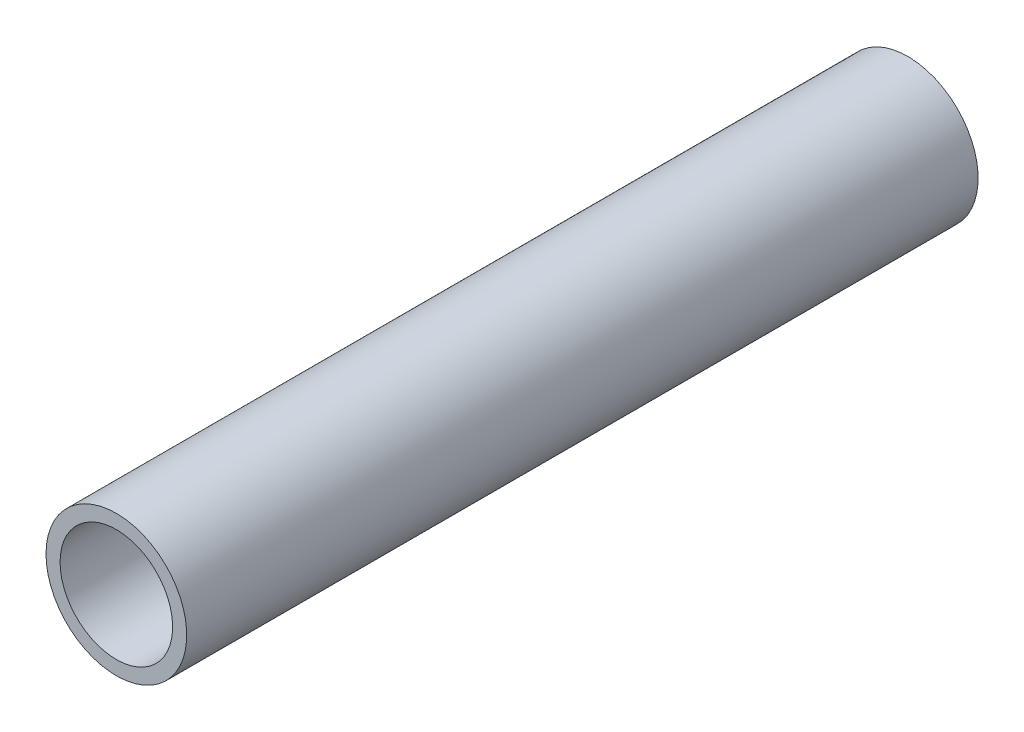
ISO-10303-21;
HEADER;
FILE_DESCRIPTION(('STEP AP214'),'2;1');
FILE_NAME('part.step','',(''),(''),'','','');
FILE_SCHEMA(('AUTOMOTIVE_DESIGN { 1 0 10303 214 1 1 1 1 }'));
ENDSEC;
DATA;
#1=APPLICATION_CONTEXT('core data for automotive mechanical design processes');
#2=APPLICATION_PROTOCOL_DEFINITION('international standard','automotive_design',2000,#1);
#3=PRODUCT_CONTEXT('',#1,'mechanical');
#4=PRODUCT('Part','Part','',(#3));
#5=PRODUCT_RELATED_PRODUCT_CATEGORY('part','',(#4));
#6=PRODUCT_DEFINITION_FORMATION('','',#4);
#7=PRODUCT_DEFINITION_CONTEXT('part definition',#1,'design');
#8=PRODUCT_DEFINITION('design','',#6,#7);
#9=PRODUCT_DEFINITION_SHAPE('','',#8);
#10=(LENGTH_UNIT() NAMED_UNIT(*) SI_UNIT(.MILLI.,.METRE.));
#11=(NAMED_UNIT(*) PLANE_ANGLE_UNIT() SI_UNIT($,.RADIAN.));
#12=(NAMED_UNIT(*) SI_UNIT($,.STERADIAN.) SOLID_ANGLE_UNIT());
#13=UNCERTAINTY_MEASURE_WITH_UNIT(LENGTH_MEASURE(1.E-05),#10,'distance_accuracy_value','');
#14=(GEOMETRIC_REPRESENTATION_CONTEXT(3) GLOBAL_UNCERTAINTY_ASSIGNED_CONTEXT((#13)) GLOBAL_UNIT_ASSIGNED_CONTEXT((#10,
#11,#12)) REPRESENTATION_CONTEXT('',''));
#15=CARTESIAN_POINT('',(0.,0.,0.));
#16=DIRECTION('',(0.,0.,1.));
#17=DIRECTION('',(1.,0.,0.));
#18=AXIS2_PLACEMENT_3D('',#15,#16,#17);
#19=CARTESIAN_POINT('',(0.,0.,22.5));
#20=DIRECTION('',(0.,0.,1.));
#21=DIRECTION('',(1.,0.,0.));
#22=AXIS2_PLACEMENT_3D('',#19,#20,#21);
#23=PLANE('',#22);
#24=CARTESIAN_POINT('',(0.,0.,22.5));
#25=DIRECTION('',(0.,0.,1.));
#26=DIRECTION('',(1.,0.,0.));
#27=AXIS2_PLACEMENT_3D('',#24,#25,#26);
#28=CIRCLE('',#27,2.);
#29=CARTESIAN_POINT('',(-2.,0.,22.5));
#30=VERTEX_POINT('',#29);
#31=EDGE_CURVE('E10',#30,#30,#28,.T.);
#32=ORIENTED_EDGE('',*,*,#31,.T.);
#33=EDGE_LOOP('',(#32));
#34=FACE_BOUND('',#33,.T.);
#35=CARTESIAN_POINT('',(0.,0.,22.5));
#36=DIRECTION('',(0.,0.,1.));
#37=DIRECTION('',(1.,0.,0.));
#38=AXIS2_PLACEMENT_3D('',#35,#36,#37);
#39=CIRCLE('',#38,1.6);
#40=CARTESIAN_POINT('',(-1.6,0.,22.5));
#41=VERTEX_POINT('',#40);
#42=EDGE_CURVE('E52',#41,#41,#39,.T.);
#43=ORIENTED_EDGE('',*,*,#42,.F.);
#44=EDGE_LOOP('',(#43));
#45=FACE_BOUND('',#44,.T.);
#46=ADVANCED_FACE('F41',(#34,#45),#23,.T.);
#47=CARTESIAN_POINT('',(0.,0.,0.));
#48=DIRECTION('',(0.,0.,1.));
#49=DIRECTION('',(1.,0.,0.));
#50=AXIS2_PLACEMENT_3D('',#47,#48,#49);
#51=PLANE('',#50);
#52=CARTESIAN_POINT('',(0.,0.,0.));
#53=DIRECTION('',(0.,0.,1.));
#54=DIRECTION('',(1.,0.,0.));
#55=AXIS2_PLACEMENT_3D('',#52,#53,#54);
#56=CIRCLE('',#55,2.);
#57=CARTESIAN_POINT('',(-2.,0.,0.));
#58=VERTEX_POINT('',#57);
#59=EDGE_CURVE('E45',#58,#58,#56,.T.);
#60=ORIENTED_EDGE('',*,*,#59,.F.);
#61=EDGE_LOOP('',(#60));
#62=FACE_BOUND('',#61,.T.);
#63=CARTESIAN_POINT('',(0.,0.,0.));
#64=DIRECTION('',(0.,0.,1.));
#65=DIRECTION('',(1.,0.,0.));
#66=AXIS2_PLACEMENT_3D('',#63,#64,#65);
#67=CIRCLE('',#66,1.6);
#68=CARTESIAN_POINT('',(-1.6,0.,0.));
#69=VERTEX_POINT('',#68);
#70=EDGE_CURVE('E54',#69,#69,#67,.T.);
#71=ORIENTED_EDGE('',*,*,#70,.T.);
#72=EDGE_LOOP('',(#71));
#73=FACE_BOUND('',#72,.T.);
#74=ADVANCED_FACE('F64',(#62,#73),#51,.F.);
#75=CARTESIAN_POINT('',(0.,0.,22.5));
#76=DIRECTION('',(0.,0.,-1.));
#77=DIRECTION('',(-1.,0.,0.));
#78=AXIS2_PLACEMENT_3D('',#75,#76,#77);
#79=CYLINDRICAL_SURFACE('',#78,2.);
#80=CARTESIAN_POINT('',(-2.,0.,22.5));
#81=CARTESIAN_POINT('',(-2.,0.,22.265625));
#82=CARTESIAN_POINT('',(-2.,0.,22.03125));
#83=CARTESIAN_POINT('',(-2.,0.,21.5625));
#84=CARTESIAN_POINT('',(-2.,0.,21.328125));
#85=CARTESIAN_POINT('',(-2.,0.,20.859375));
#86=CARTESIAN_POINT('',(-2.,0.,20.625));
#87=CARTESIAN_POINT('',(-2.,0.,20.15625));
#88=CARTESIAN_POINT('',(-2.,0.,19.921875));
#89=CARTESIAN_POINT('',(-2.,0.,19.453125));
#90=CARTESIAN_POINT('',(-2.,0.,19.21875));
#91=CARTESIAN_POINT('',(-2.,0.,18.75));
#92=CARTESIAN_POINT('',(-2.,0.,18.515625));
#93=CARTESIAN_POINT('',(-2.,0.,18.046875));
#94=CARTESIAN_POINT('',(-2.,0.,17.8125));
#95=CARTESIAN_POINT('',(-2.,0.,17.34375));
#96=CARTESIAN_POINT('',(-2.,0.,17.109375));
#97=CARTESIAN_POINT('',(-2.,0.,16.640625));
#98=CARTESIAN_POINT('',(-2.,0.,16.40625));
#99=CARTESIAN_POINT('',(-2.,0.,15.9375));
#100=CARTESIAN_POINT('',(-2.,0.,15.703125));
#101=CARTESIAN_POINT('',(-2.,0.,15.234375));
#102=CARTESIAN_POINT('',(-2.,0.,15.));
#103=CARTESIAN_POINT('',(-2.,0.,14.53125));
#104=CARTESIAN_POINT('',(-2.,0.,14.296875));
#105=CARTESIAN_POINT('',(-2.,0.,13.828125));
#106=CARTESIAN_POINT('',(-2.,0.,13.59375));
#107=CARTESIAN_POINT('',(-2.,0.,13.125));
#108=CARTESIAN_POINT('',(-2.,0.,12.890625));
#109=CARTESIAN_POINT('',(-2.,0.,12.421875));
#110=CARTESIAN_POINT('',(-2.,0.,12.1875));
#111=CARTESIAN_POINT('',(-2.,0.,11.71875));
#112=CARTESIAN_POINT('',(-2.,0.,11.484375));
#113=CARTESIAN_POINT('',(-2.,0.,11.015625));
#114=CARTESIAN_POINT('',(-2.,0.,10.78125));
#115=CARTESIAN_POINT('',(-2.,0.,10.3125));
#116=CARTESIAN_POINT('',(-2.,0.,10.078125));
#117=CARTESIAN_POINT('',(-2.,0.,9.609375));
#118=CARTESIAN_POINT('',(-2.,0.,9.375));
#119=CARTESIAN_POINT('',(-2.,0.,8.90625));
#120=CARTESIAN_POINT('',(-2.,0.,8.671875));
#121=CARTESIAN_POINT('',(-2.,0.,8.203125));
#122=CARTESIAN_POINT('',(-2.,0.,7.96875));
#123=CARTESIAN_POINT('',(-2.,0.,7.5));
#124=CARTESIAN_POINT('',(-2.,0.,7.265625));
#125=CARTESIAN_POINT('',(-2.,0.,6.796875));
#126=CARTESIAN_POINT('',(-2.,0.,6.5625));
#127=CARTESIAN_POINT('',(-2.,0.,6.09375));
#128=CARTESIAN_POINT('',(-2.,0.,5.859375));
#129=CARTESIAN_POINT('',(-2.,0.,5.390625));
#130=CARTESIAN_POINT('',(-2.,0.,5.15625));
#131=CARTESIAN_POINT('',(-2.,0.,4.6875));
#132=CARTESIAN_POINT('',(-2.,0.,4.453125));
#133=CARTESIAN_POINT('',(-2.,0.,3.984375));
#134=CARTESIAN_POINT('',(-2.,0.,3.75));
#135=CARTESIAN_POINT('',(-2.,0.,3.28125));
#136=CARTESIAN_POINT('',(-2.,0.,3.046875));
#137=CARTESIAN_POINT('',(-2.,0.,2.578125));
#138=CARTESIAN_POINT('',(-2.,0.,2.34375));
#139=CARTESIAN_POINT('',(-2.,0.,1.875));
#140=CARTESIAN_POINT('',(-2.,0.,1.640625));
#141=CARTESIAN_POINT('',(-2.,0.,1.171875));
#142=CARTESIAN_POINT('',(-2.,0.,0.937499999999996));
#143=CARTESIAN_POINT('',(-2.,0.,0.468749999999996));
#144=CARTESIAN_POINT('',(-2.,0.,0.234374999999996));
#145=CARTESIAN_POINT('',(-2.,0.,0.));
#146=B_SPLINE_CURVE_WITH_KNOTS('',3,(#80,#81,#82,#83,#84,#85,#86,#87,#88,#89,#90,#91,#92,#93,
#94,#95,#96,#97,#98,#99,#100,#101,#102,#103,#104,#105,#106,#107,#108,#109,#110,#111,#112,#113,
#114,#115,#116,#117,#118,#119,#120,#121,#122,#123,#124,#125,#126,#127,#128,#129,#130,#131,#132,
#133,#134,#135,#136,#137,#138,#139,#140,#141,#142,#143,#144,#145),.UNSPECIFIED.,.F.,.F.,(4,2,2,
2,2,2,2,2,2,2,2,2,2,2,2,2,2,2,2,2,2,2,2,2,2,2,2,2,2,2,2,2,4),(0.,0.703124999999999,1.40625,
2.109375,2.8125,3.515625,4.21875,4.921875,5.625,6.328125,7.03125,7.734375,8.4375,9.140625,
9.84375,10.546875,11.25,11.953125,12.65625,13.359375,14.0625,14.765625,15.46875,16.171875,
16.875,17.578125,18.28125,18.984375,19.6875,20.390625,21.09375,21.796875,22.5),.UNSPECIFIED.);
#147=EDGE_CURVE('BSEAM43',#30,#58,#146,.T.);
#148=ORIENTED_EDGE('',*,*,#31,.F.);
#149=ORIENTED_EDGE('',*,*,#59,.T.);
#150=ORIENTED_EDGE('',*,*,#147,.T.);
#151=ORIENTED_EDGE('',*,*,#147,.F.);
#152=EDGE_LOOP('',(#148,#150,#149,#151));
#153=FACE_BOUND('',#152,.T.);
#154=ADVANCED_FACE('F43',(#153),#79,.T.);
#155=CARTESIAN_POINT('',(0.,0.,22.5));
#156=DIRECTION('',(0.,0.,-1.));
#157=DIRECTION('',(-1.,0.,0.));
#158=AXIS2_PLACEMENT_3D('',#155,#156,#157);
#159=CYLINDRICAL_SURFACE('',#158,1.6);
#160=CARTESIAN_POINT('',(-1.6,0.,22.5));
#161=CARTESIAN_POINT('',(-1.6,0.,22.265625));
#162=CARTESIAN_POINT('',(-1.6,0.,22.03125));
#163=CARTESIAN_POINT('',(-1.6,0.,21.5625));
#164=CARTESIAN_POINT('',(-1.6,0.,21.328125));
#165=CARTESIAN_POINT('',(-1.6,0.,20.859375));
#166=CARTESIAN_POINT('',(-1.6,0.,20.625));
#167=CARTESIAN_POINT('',(-1.6,0.,20.15625));
#168=CARTESIAN_POINT('',(-1.6,0.,19.921875));
#169=CARTESIAN_POINT('',(-1.6,0.,19.453125));
#170=CARTESIAN_POINT('',(-1.6,0.,19.21875));
#171=CARTESIAN_POINT('',(-1.6,0.,18.75));
#172=CARTESIAN_POINT('',(-1.6,0.,18.515625));
#173=CARTESIAN_POINT('',(-1.6,0.,18.046875));
#174=CARTESIAN_POINT('',(-1.6,0.,17.8125));
#175=CARTESIAN_POINT('',(-1.6,0.,17.34375));
#176=CARTESIAN_POINT('',(-1.6,0.,17.109375));
#177=CARTESIAN_POINT('',(-1.6,0.,16.640625));
#178=CARTESIAN_POINT('',(-1.6,0.,16.40625));
#179=CARTESIAN_POINT('',(-1.6,0.,15.9375));
#180=CARTESIAN_POINT('',(-1.6,0.,15.703125));
#181=CARTESIAN_POINT('',(-1.6,0.,15.234375));
#182=CARTESIAN_POINT('',(-1.6,0.,15.));
#183=CARTESIAN_POINT('',(-1.6,0.,14.53125));
#184=CARTESIAN_POINT('',(-1.6,0.,14.296875));
#185=CARTESIAN_POINT('',(-1.6,0.,13.828125));
#186=CARTESIAN_POINT('',(-1.6,0.,13.59375));
#187=CARTESIAN_POINT('',(-1.6,0.,13.125));
#188=CARTESIAN_POINT('',(-1.6,0.,12.890625));
#189=CARTESIAN_POINT('',(-1.6,0.,12.421875));
#190=CARTESIAN_POINT('',(-1.6,0.,12.1875));
#191=CARTESIAN_POINT('',(-1.6,0.,11.71875));
#192=CARTESIAN_POINT('',(-1.6,0.,11.484375));
#193=CARTESIAN_POINT('',(-1.6,0.,11.015625));
#194=CARTESIAN_POINT('',(-1.6,0.,10.78125));
#195=CARTESIAN_POINT('',(-1.6,0.,10.3125));
#196=CARTESIAN_POINT('',(-1.6,0.,10.078125));
#197=CARTESIAN_POINT('',(-1.6,0.,9.609375));
#198=CARTESIAN_POINT('',(-1.6,0.,9.375));
#199=CARTESIAN_POINT('',(-1.6,0.,8.90625));
#200=CARTESIAN_POINT('',(-1.6,0.,8.671875));
#201=CARTESIAN_POINT('',(-1.6,0.,8.203125));
#202=CARTESIAN_POINT('',(-1.6,0.,7.96875));
#203=CARTESIAN_POINT('',(-1.6,0.,7.5));
#204=CARTESIAN_POINT('',(-1.6,0.,7.265625));
#205=CARTESIAN_POINT('',(-1.6,0.,6.796875));
#206=CARTESIAN_POINT('',(-1.6,0.,6.5625));
#207=CARTESIAN_POINT('',(-1.6,0.,6.09375));
#208=CARTESIAN_POINT('',(-1.6,0.,5.859375));
#209=CARTESIAN_POINT('',(-1.6,0.,5.390625));
#210=CARTESIAN_POINT('',(-1.6,0.,5.15625));
#211=CARTESIAN_POINT('',(-1.6,0.,4.6875));
#212=CARTESIAN_POINT('',(-1.6,0.,4.453125));
#213=CARTESIAN_POINT('',(-1.6,0.,3.984375));
#214=CARTESIAN_POINT('',(-1.6,0.,3.75));
#215=CARTESIAN_POINT('',(-1.6,0.,3.28125));
#216=CARTESIAN_POINT('',(-1.6,0.,3.046875));
#217=CARTESIAN_POINT('',(-1.6,0.,2.578125));
#218=CARTESIAN_POINT('',(-1.6,0.,2.34375));
#219=CARTESIAN_POINT('',(-1.6,0.,1.875));
#220=CARTESIAN_POINT('',(-1.6,0.,1.640625));
#221=CARTESIAN_POINT('',(-1.6,0.,1.171875));
#222=CARTESIAN_POINT('',(-1.6,0.,0.937499999999996));
#223=CARTESIAN_POINT('',(-1.6,0.,0.468749999999996));
#224=CARTESIAN_POINT('',(-1.6,0.,0.234374999999996));
#225=CARTESIAN_POINT('',(-1.6,0.,0.));
#226=B_SPLINE_CURVE_WITH_KNOTS('',3,(#160,#161,#162,#163,#164,#165,#166,#167,#168,#169,#170,
#171,#172,#173,#174,#175,#176,#177,#178,#179,#180,#181,#182,#183,#184,#185,#186,#187,#188,#189,
#190,#191,#192,#193,#194,#195,#196,#197,#198,#199,#200,#201,#202,#203,#204,#205,#206,#207,#208,
#209,#210,#211,#212,#213,#214,#215,#216,#217,#218,#219,#220,#221,#222,#223,#224,#225),
.UNSPECIFIED.,.F.,.F.,(4,2,2,2,2,2,2,2,2,2,2,2,2,2,2,2,2,2,2,2,2,2,2,2,2,2,2,2,2,2,2,2,4),(0.,
0.703124999999999,1.40625,2.109375,2.8125,3.515625,4.21875,4.921875,5.625,6.328125,7.03125,
7.734375,8.4375,9.140625,9.84375,10.546875,11.25,11.953125,12.65625,13.359375,14.0625,14.765625,
15.46875,16.171875,16.875,17.578125,18.28125,18.984375,19.6875,20.390625,21.09375,21.796875,
22.5),.UNSPECIFIED.);
#227=EDGE_CURVE('BSEAM60',#41,#69,#226,.T.);
#228=ORIENTED_EDGE('',*,*,#42,.T.);
#229=ORIENTED_EDGE('',*,*,#70,.F.);
#230=ORIENTED_EDGE('',*,*,#227,.T.);
#231=ORIENTED_EDGE('',*,*,#227,.F.);
#232=EDGE_LOOP('',(#228,#230,#229,#231));
#233=FACE_BOUND('',#232,.T.);
#234=ADVANCED_FACE('F60',(#233),#159,.F.);
#235=CLOSED_SHELL('',(#46,#74,#154,#234));
#236=MANIFOLD_SOLID_BREP('B2',#235);
#237=ADVANCED_BREP_SHAPE_REPRESENTATION('',(#18,#236),#14);
#238=SHAPE_DEFINITION_REPRESENTATION(#9,#237);
ENDSEC;
END-ISO-10303-21;
